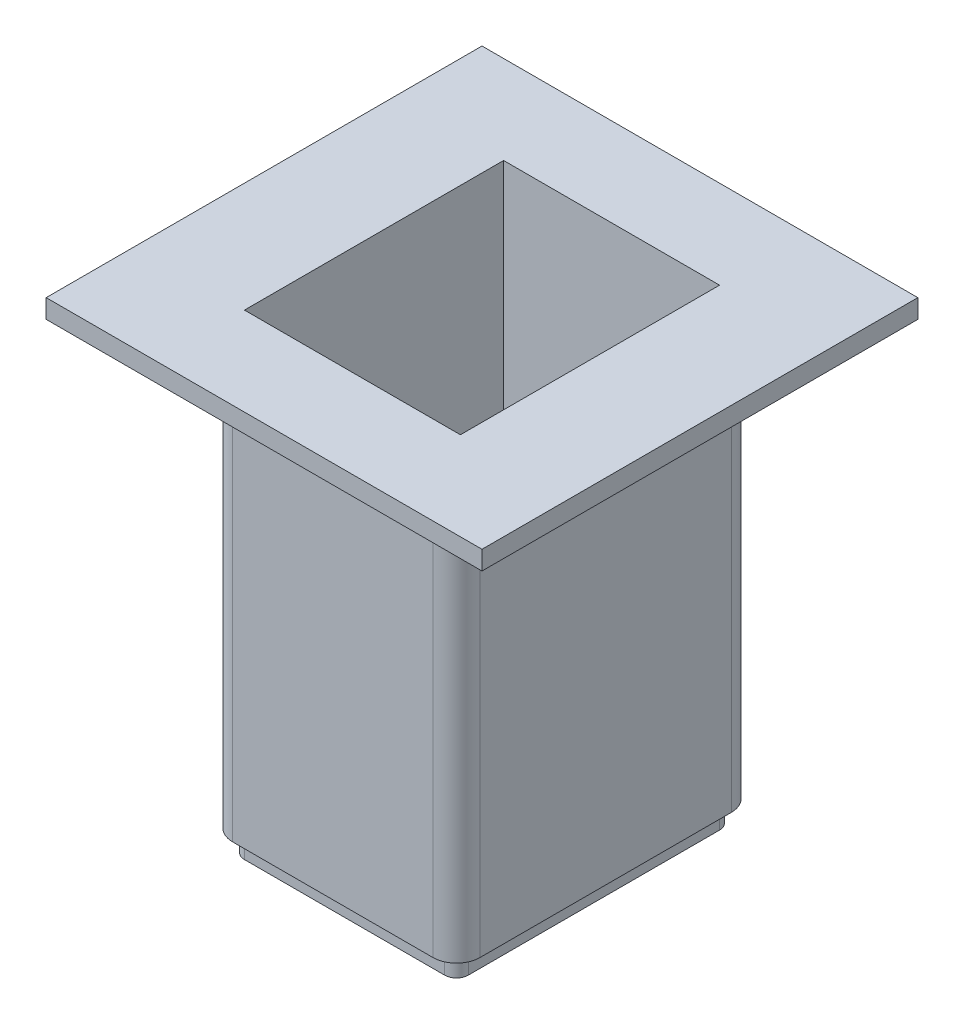
ISO-10303-21;
HEADER;
FILE_DESCRIPTION(('STEP AP214'),'2;1');
FILE_NAME('part.step','',(''),(''),'','','');
FILE_SCHEMA(('AUTOMOTIVE_DESIGN { 1 0 10303 214 1 1 1 1 }'));
ENDSEC;
DATA;
#1=APPLICATION_CONTEXT('core data for automotive mechanical design processes');
#2=APPLICATION_PROTOCOL_DEFINITION('international standard','automotive_design',2000,#1);
#3=PRODUCT_CONTEXT('',#1,'mechanical');
#4=PRODUCT('Part','Part','',(#3));
#5=PRODUCT_RELATED_PRODUCT_CATEGORY('part','',(#4));
#6=PRODUCT_DEFINITION_FORMATION('','',#4);
#7=PRODUCT_DEFINITION_CONTEXT('part definition',#1,'design');
#8=PRODUCT_DEFINITION('design','',#6,#7);
#9=PRODUCT_DEFINITION_SHAPE('','',#8);
#10=(LENGTH_UNIT() NAMED_UNIT(*) SI_UNIT(.MILLI.,.METRE.));
#11=(NAMED_UNIT(*) PLANE_ANGLE_UNIT() SI_UNIT($,.RADIAN.));
#12=(NAMED_UNIT(*) SI_UNIT($,.STERADIAN.) SOLID_ANGLE_UNIT());
#13=UNCERTAINTY_MEASURE_WITH_UNIT(LENGTH_MEASURE(1.E-05),#10,'distance_accuracy_value','');
#14=(GEOMETRIC_REPRESENTATION_CONTEXT(3) GLOBAL_UNCERTAINTY_ASSIGNED_CONTEXT((#13)) GLOBAL_UNIT_ASSIGNED_CONTEXT((#10,
#11,#12)) REPRESENTATION_CONTEXT('',''));
#15=CARTESIAN_POINT('',(0.,0.,0.));
#16=DIRECTION('',(0.,0.,1.));
#17=DIRECTION('',(1.,0.,0.));
#18=AXIS2_PLACEMENT_3D('',#15,#16,#17);
#19=CARTESIAN_POINT('',(13.25,27.85,16.5));
#20=DIRECTION('',(0.,0.,-1.));
#21=DIRECTION('',(-1.,0.,0.));
#22=AXIS2_PLACEMENT_3D('',#19,#20,#21);
#23=PLANE('',#22);
#24=DIRECTION('',(0.,-1.,0.));
#25=VECTOR('',#24,1.);
#26=CARTESIAN_POINT('',(13.75,31.95,16.5));
#27=LINE('',#26,#25);
#28=CARTESIAN_POINT('',(13.75,30.25,16.5));
#29=VERTEX_POINT('',#28);
#30=CARTESIAN_POINT('',(13.75,-29.35,16.5));
#31=VERTEX_POINT('',#30);
#32=EDGE_CURVE('E213',#29,#31,#27,.T.);
#33=ORIENTED_EDGE('',*,*,#32,.T.);
#34=DIRECTION('',(-1.,0.,0.));
#35=VECTOR('',#34,1.);
#36=CARTESIAN_POINT('',(13.75,-29.35,16.5));
#37=LINE('',#36,#35);
#38=CARTESIAN_POINT('',(-13.75,-29.35,16.5));
#39=VERTEX_POINT('',#38);
#40=EDGE_CURVE('E198',#31,#39,#37,.T.);
#41=ORIENTED_EDGE('',*,*,#40,.T.);
#42=DIRECTION('',(0.,-1.,0.));
#43=VECTOR('',#42,1.);
#44=CARTESIAN_POINT('',(-13.75,31.95,16.5));
#45=LINE('',#44,#43);
#46=CARTESIAN_POINT('',(-13.75,30.25,16.5));
#47=VERTEX_POINT('',#46);
#48=EDGE_CURVE('E232',#47,#39,#45,.T.);
#49=ORIENTED_EDGE('',*,*,#48,.F.);
#50=DIRECTION('',(-1.,0.,0.));
#51=VECTOR('',#50,1.);
#52=CARTESIAN_POINT('',(13.25,30.25,16.5));
#53=LINE('',#52,#51);
#54=EDGE_CURVE('E218',#29,#47,#53,.T.);
#55=ORIENTED_EDGE('',*,*,#54,.F.);
#56=EDGE_LOOP('',(#33,#41,#49,#55));
#57=FACE_BOUND('',#56,.T.);
#58=ADVANCED_FACE('F40',(#57),#23,.T.);
#59=CARTESIAN_POINT('',(13.25,27.85,-16.5));
#60=DIRECTION('',(0.,0.,1.));
#61=DIRECTION('',(1.,0.,0.));
#62=AXIS2_PLACEMENT_3D('',#59,#60,#61);
#63=PLANE('',#62);
#64=DIRECTION('',(0.,-1.,0.));
#65=VECTOR('',#64,1.);
#66=CARTESIAN_POINT('',(-13.75,31.95,-16.5));
#67=LINE('',#66,#65);
#68=CARTESIAN_POINT('',(-13.75,30.25,-16.5));
#69=VERTEX_POINT('',#68);
#70=CARTESIAN_POINT('',(-13.75,-29.35,-16.5));
#71=VERTEX_POINT('',#70);
#72=EDGE_CURVE('E219',#69,#71,#67,.T.);
#73=ORIENTED_EDGE('',*,*,#72,.T.);
#74=DIRECTION('',(1.,0.,0.));
#75=VECTOR('',#74,1.);
#76=CARTESIAN_POINT('',(-13.75,-29.35,-16.5));
#77=LINE('',#76,#75);
#78=CARTESIAN_POINT('',(13.75,-29.35,-16.5));
#79=VERTEX_POINT('',#78);
#80=EDGE_CURVE('E62',#71,#79,#77,.T.);
#81=ORIENTED_EDGE('',*,*,#80,.T.);
#82=DIRECTION('',(0.,-1.,0.));
#83=VECTOR('',#82,1.);
#84=CARTESIAN_POINT('',(13.75,31.95,-16.5));
#85=LINE('',#84,#83);
#86=CARTESIAN_POINT('',(13.75,30.25,-16.5));
#87=VERTEX_POINT('',#86);
#88=EDGE_CURVE('E216',#87,#79,#85,.T.);
#89=ORIENTED_EDGE('',*,*,#88,.F.);
#90=DIRECTION('',(1.,0.,0.));
#91=VECTOR('',#90,1.);
#92=CARTESIAN_POINT('',(13.25,30.25,-16.5));
#93=LINE('',#92,#91);
#94=EDGE_CURVE('E288',#69,#87,#93,.T.);
#95=ORIENTED_EDGE('',*,*,#94,.F.);
#96=EDGE_LOOP('',(#73,#81,#89,#95));
#97=FACE_BOUND('',#96,.T.);
#98=ADVANCED_FACE('F396',(#97),#63,.T.);
#99=CARTESIAN_POINT('',(14.25,27.85,17.5));
#100=DIRECTION('',(0.,0.,-1.));
#101=DIRECTION('',(-1.,0.,0.));
#102=AXIS2_PLACEMENT_3D('',#99,#100,#101);
#103=PLANE('',#102);
#104=DIRECTION('',(-1.,0.,0.));
#105=VECTOR('',#104,1.);
#106=CARTESIAN_POINT('',(12.75,-29.35,17.5));
#107=LINE('',#106,#105);
#108=CARTESIAN_POINT('',(12.75,-29.35,17.5));
#109=VERTEX_POINT('',#108);
#110=CARTESIAN_POINT('',(-12.75,-29.35,17.5));
#111=VERTEX_POINT('',#110);
#112=EDGE_CURVE('E385',#109,#111,#107,.T.);
#113=ORIENTED_EDGE('',*,*,#112,.F.);
#114=DIRECTION('',(0.,-1.,0.));
#115=VECTOR('',#114,1.);
#116=CARTESIAN_POINT('',(12.75,27.85,17.5));
#117=LINE('',#116,#115);
#118=CARTESIAN_POINT('',(12.75,-26.65,17.5));
#119=VERTEX_POINT('',#118);
#120=EDGE_CURVE('E258',#109,#119,#117,.F.);
#121=ORIENTED_EDGE('',*,*,#120,.T.);
#122=DIRECTION('',(-1.,0.,0.));
#123=VECTOR('',#122,1.);
#124=CARTESIAN_POINT('',(12.75,-26.65,17.5));
#125=LINE('',#124,#123);
#126=CARTESIAN_POINT('',(-12.75,-26.65,17.5));
#127=VERTEX_POINT('',#126);
#128=EDGE_CURVE('E363',#119,#127,#125,.T.);
#129=ORIENTED_EDGE('',*,*,#128,.T.);
#130=DIRECTION('',(0.,-1.,0.));
#131=VECTOR('',#130,1.);
#132=CARTESIAN_POINT('',(-12.75,27.85,17.5));
#133=LINE('',#132,#131);
#134=EDGE_CURVE('E269',#127,#111,#133,.T.);
#135=ORIENTED_EDGE('',*,*,#134,.T.);
#136=EDGE_LOOP('',(#113,#121,#129,#135));
#137=FACE_BOUND('',#136,.T.);
#138=ADVANCED_FACE('F424',(#137),#103,.F.);
#139=CARTESIAN_POINT('',(14.25,27.85,17.5));
#140=DIRECTION('',(-1.,0.,0.));
#141=DIRECTION('',(0.,0.,1.));
#142=AXIS2_PLACEMENT_3D('',#139,#140,#141);
#143=PLANE('',#142);
#144=DIRECTION('',(0.,0.,1.));
#145=VECTOR('',#144,1.);
#146=CARTESIAN_POINT('',(14.25,-29.35,-16.));
#147=LINE('',#146,#145);
#148=CARTESIAN_POINT('',(14.25,-29.35,-16.));
#149=VERTEX_POINT('',#148);
#150=CARTESIAN_POINT('',(14.25,-29.35,16.));
#151=VERTEX_POINT('',#150);
#152=EDGE_CURVE('E54',#149,#151,#147,.T.);
#153=ORIENTED_EDGE('',*,*,#152,.F.);
#154=DIRECTION('',(0.,-1.,0.));
#155=VECTOR('',#154,1.);
#156=CARTESIAN_POINT('',(14.25,27.85,-16.));
#157=LINE('',#156,#155);
#158=CARTESIAN_POINT('',(14.25,-26.65,-16.));
#159=VERTEX_POINT('',#158);
#160=EDGE_CURVE('E275',#149,#159,#157,.F.);
#161=ORIENTED_EDGE('',*,*,#160,.T.);
#162=DIRECTION('',(0.,0.,1.));
#163=VECTOR('',#162,1.);
#164=CARTESIAN_POINT('',(14.25,-26.65,-16.));
#165=LINE('',#164,#163);
#166=CARTESIAN_POINT('',(14.25,-26.65,16.));
#167=VERTEX_POINT('',#166);
#168=EDGE_CURVE('E368',#159,#167,#165,.T.);
#169=ORIENTED_EDGE('',*,*,#168,.T.);
#170=DIRECTION('',(0.,-1.,0.));
#171=VECTOR('',#170,1.);
#172=CARTESIAN_POINT('',(14.25,27.85,16.));
#173=LINE('',#172,#171);
#174=EDGE_CURVE('E283',#167,#151,#173,.T.);
#175=ORIENTED_EDGE('',*,*,#174,.T.);
#176=EDGE_LOOP('',(#153,#161,#169,#175));
#177=FACE_BOUND('',#176,.T.);
#178=ADVANCED_FACE('F428',(#177),#143,.F.);
#179=CARTESIAN_POINT('',(14.25,27.85,-17.5));
#180=DIRECTION('',(0.,0.,1.));
#181=DIRECTION('',(1.,0.,0.));
#182=AXIS2_PLACEMENT_3D('',#179,#180,#181);
#183=PLANE('',#182);
#184=DIRECTION('',(1.,0.,0.));
#185=VECTOR('',#184,1.);
#186=CARTESIAN_POINT('',(-12.75,-29.35,-17.5));
#187=LINE('',#186,#185);
#188=CARTESIAN_POINT('',(-12.75,-29.35,-17.5));
#189=VERTEX_POINT('',#188);
#190=CARTESIAN_POINT('',(12.75,-29.35,-17.5));
#191=VERTEX_POINT('',#190);
#192=EDGE_CURVE('E377',#189,#191,#187,.T.);
#193=ORIENTED_EDGE('',*,*,#192,.F.);
#194=DIRECTION('',(0.,-1.,0.));
#195=VECTOR('',#194,1.);
#196=CARTESIAN_POINT('',(-12.75,27.85,-17.5));
#197=LINE('',#196,#195);
#198=CARTESIAN_POINT('',(-12.75,-26.65,-17.5));
#199=VERTEX_POINT('',#198);
#200=EDGE_CURVE('E281',#189,#199,#197,.F.);
#201=ORIENTED_EDGE('',*,*,#200,.T.);
#202=DIRECTION('',(1.,0.,0.));
#203=VECTOR('',#202,1.);
#204=CARTESIAN_POINT('',(-12.75,-26.65,-17.5));
#205=LINE('',#204,#203);
#206=CARTESIAN_POINT('',(12.75,-26.65,-17.5));
#207=VERTEX_POINT('',#206);
#208=EDGE_CURVE('E351',#199,#207,#205,.T.);
#209=ORIENTED_EDGE('',*,*,#208,.T.);
#210=DIRECTION('',(0.,-1.,0.));
#211=VECTOR('',#210,1.);
#212=CARTESIAN_POINT('',(12.75,27.85,-17.5));
#213=LINE('',#212,#211);
#214=EDGE_CURVE('E278',#207,#191,#213,.T.);
#215=ORIENTED_EDGE('',*,*,#214,.T.);
#216=EDGE_LOOP('',(#193,#201,#209,#215));
#217=FACE_BOUND('',#216,.T.);
#218=ADVANCED_FACE('F467',(#217),#183,.F.);
#219=CARTESIAN_POINT('',(-14.25,27.85,17.5));
#220=DIRECTION('',(1.,0.,0.));
#221=DIRECTION('',(0.,0.,-1.));
#222=AXIS2_PLACEMENT_3D('',#219,#220,#221);
#223=PLANE('',#222);
#224=DIRECTION('',(0.,0.,-1.));
#225=VECTOR('',#224,1.);
#226=CARTESIAN_POINT('',(-14.25,-29.35,16.));
#227=LINE('',#226,#225);
#228=CARTESIAN_POINT('',(-14.25,-29.35,16.));
#229=VERTEX_POINT('',#228);
#230=CARTESIAN_POINT('',(-14.25,-29.35,-16.));
#231=VERTEX_POINT('',#230);
#232=EDGE_CURVE('E381',#229,#231,#227,.T.);
#233=ORIENTED_EDGE('',*,*,#232,.F.);
#234=DIRECTION('',(0.,-1.,0.));
#235=VECTOR('',#234,1.);
#236=CARTESIAN_POINT('',(-14.25,27.85,16.));
#237=LINE('',#236,#235);
#238=CARTESIAN_POINT('',(-14.25,-26.65,16.));
#239=VERTEX_POINT('',#238);
#240=EDGE_CURVE('E226',#229,#239,#237,.F.);
#241=ORIENTED_EDGE('',*,*,#240,.T.);
#242=DIRECTION('',(0.,0.,-1.));
#243=VECTOR('',#242,1.);
#244=CARTESIAN_POINT('',(-14.25,-26.65,16.));
#245=LINE('',#244,#243);
#246=CARTESIAN_POINT('',(-14.25,-26.65,-16.));
#247=VERTEX_POINT('',#246);
#248=EDGE_CURVE('E357',#239,#247,#245,.T.);
#249=ORIENTED_EDGE('',*,*,#248,.T.);
#250=DIRECTION('',(0.,-1.,0.));
#251=VECTOR('',#250,1.);
#252=CARTESIAN_POINT('',(-14.25,27.85,-16.));
#253=LINE('',#252,#251);
#254=EDGE_CURVE('E220',#247,#231,#253,.T.);
#255=ORIENTED_EDGE('',*,*,#254,.T.);
#256=EDGE_LOOP('',(#233,#241,#249,#255));
#257=FACE_BOUND('',#256,.T.);
#258=ADVANCED_FACE('F462',(#257),#223,.F.);
#259=CARTESIAN_POINT('',(-12.75,27.85,16.));
#260=DIRECTION('',(0.,-1.,0.));
#261=DIRECTION('',(0.,0.,-1.));
#262=AXIS2_PLACEMENT_3D('',#259,#260,#261);
#263=CYLINDRICAL_SURFACE('',#262,1.5);
#264=ORIENTED_EDGE('',*,*,#240,.F.);
#265=CARTESIAN_POINT('',(-12.75,-29.35,16.));
#266=DIRECTION('',(0.,-1.,0.));
#267=DIRECTION('',(0.,0.,-1.));
#268=AXIS2_PLACEMENT_3D('',#265,#266,#267);
#269=CIRCLE('',#268,1.5);
#270=EDGE_CURVE('E383',#111,#229,#269,.T.);
#271=ORIENTED_EDGE('',*,*,#270,.F.);
#272=ORIENTED_EDGE('',*,*,#134,.F.);
#273=CARTESIAN_POINT('',(-12.75,-26.65,16.));
#274=DIRECTION('',(0.,-1.,0.));
#275=DIRECTION('',(0.,0.,-1.));
#276=AXIS2_PLACEMENT_3D('',#273,#274,#275);
#277=CIRCLE('',#276,1.5);
#278=EDGE_CURVE('E360',#127,#239,#277,.T.);
#279=ORIENTED_EDGE('',*,*,#278,.T.);
#280=EDGE_LOOP('',(#264,#271,#272,#279));
#281=FACE_BOUND('',#280,.T.);
#282=ADVANCED_FACE('F459',(#281),#263,.T.);
#283=CARTESIAN_POINT('',(-12.75,27.85,-16.));
#284=DIRECTION('',(0.,-1.,0.));
#285=DIRECTION('',(0.,0.,-1.));
#286=AXIS2_PLACEMENT_3D('',#283,#284,#285);
#287=CYLINDRICAL_SURFACE('',#286,1.5);
#288=ORIENTED_EDGE('',*,*,#200,.F.);
#289=CARTESIAN_POINT('',(-12.75,-29.35,-16.));
#290=DIRECTION('',(0.,-1.,0.));
#291=DIRECTION('',(0.,0.,-1.));
#292=AXIS2_PLACEMENT_3D('',#289,#290,#291);
#293=CIRCLE('',#292,1.5);
#294=EDGE_CURVE('E379',#231,#189,#293,.T.);
#295=ORIENTED_EDGE('',*,*,#294,.F.);
#296=ORIENTED_EDGE('',*,*,#254,.F.);
#297=CARTESIAN_POINT('',(-12.75,-26.65,-16.));
#298=DIRECTION('',(0.,-1.,0.));
#299=DIRECTION('',(0.,0.,-1.));
#300=AXIS2_PLACEMENT_3D('',#297,#298,#299);
#301=CIRCLE('',#300,1.5);
#302=EDGE_CURVE('E354',#247,#199,#301,.T.);
#303=ORIENTED_EDGE('',*,*,#302,.T.);
#304=EDGE_LOOP('',(#288,#295,#296,#303));
#305=FACE_BOUND('',#304,.T.);
#306=ADVANCED_FACE('F450',(#305),#287,.T.);
#307=CARTESIAN_POINT('',(12.75,27.85,-16.));
#308=DIRECTION('',(0.,-1.,0.));
#309=DIRECTION('',(0.,0.,-1.));
#310=AXIS2_PLACEMENT_3D('',#307,#308,#309);
#311=CYLINDRICAL_SURFACE('',#310,1.5);
#312=ORIENTED_EDGE('',*,*,#160,.F.);
#313=CARTESIAN_POINT('',(12.75,-29.35,-16.));
#314=DIRECTION('',(0.,-1.,0.));
#315=DIRECTION('',(0.,0.,-1.));
#316=AXIS2_PLACEMENT_3D('',#313,#314,#315);
#317=CIRCLE('',#316,1.5);
#318=EDGE_CURVE('E375',#191,#149,#317,.T.);
#319=ORIENTED_EDGE('',*,*,#318,.F.);
#320=ORIENTED_EDGE('',*,*,#214,.F.);
#321=CARTESIAN_POINT('',(12.75,-26.65,-16.));
#322=DIRECTION('',(0.,-1.,0.));
#323=DIRECTION('',(0.,0.,-1.));
#324=AXIS2_PLACEMENT_3D('',#321,#322,#323);
#325=CIRCLE('',#324,1.5);
#326=EDGE_CURVE('E371',#207,#159,#325,.T.);
#327=ORIENTED_EDGE('',*,*,#326,.T.);
#328=EDGE_LOOP('',(#312,#319,#320,#327));
#329=FACE_BOUND('',#328,.T.);
#330=ADVANCED_FACE('F444',(#329),#311,.T.);
#331=CARTESIAN_POINT('',(12.75,27.85,16.));
#332=DIRECTION('',(0.,-1.,0.));
#333=DIRECTION('',(0.,0.,-1.));
#334=AXIS2_PLACEMENT_3D('',#331,#332,#333);
#335=CYLINDRICAL_SURFACE('',#334,1.5);
#336=ORIENTED_EDGE('',*,*,#120,.F.);
#337=CARTESIAN_POINT('',(12.75,-29.35,16.));
#338=DIRECTION('',(0.,-1.,0.));
#339=DIRECTION('',(0.,0.,-1.));
#340=AXIS2_PLACEMENT_3D('',#337,#338,#339);
#341=CIRCLE('',#340,1.5);
#342=EDGE_CURVE('E387',#151,#109,#341,.T.);
#343=ORIENTED_EDGE('',*,*,#342,.F.);
#344=ORIENTED_EDGE('',*,*,#174,.F.);
#345=CARTESIAN_POINT('',(12.75,-26.65,16.));
#346=DIRECTION('',(0.,-1.,0.));
#347=DIRECTION('',(0.,0.,-1.));
#348=AXIS2_PLACEMENT_3D('',#345,#346,#347);
#349=CIRCLE('',#348,1.5);
#350=EDGE_CURVE('E365',#167,#119,#349,.T.);
#351=ORIENTED_EDGE('',*,*,#350,.T.);
#352=EDGE_LOOP('',(#336,#343,#344,#351));
#353=FACE_BOUND('',#352,.T.);
#354=ADVANCED_FACE('F440',(#353),#335,.T.);
#355=CARTESIAN_POINT('',(13.75,31.95,-16.5));
#356=DIRECTION('',(1.,0.,0.));
#357=DIRECTION('',(0.,0.,-1.));
#358=AXIS2_PLACEMENT_3D('',#355,#356,#357);
#359=PLANE('',#358);
#360=DIRECTION('',(0.,0.,1.));
#361=VECTOR('',#360,1.);
#362=CARTESIAN_POINT('',(13.75,-29.35,-16.5));
#363=LINE('',#362,#361);
#364=EDGE_CURVE('E201',#79,#31,#363,.T.);
#365=ORIENTED_EDGE('',*,*,#364,.T.);
#366=ORIENTED_EDGE('',*,*,#32,.F.);
#367=DIRECTION('',(0.,0.,1.));
#368=VECTOR('',#367,1.);
#369=CARTESIAN_POINT('',(13.75,30.25,0.));
#370=LINE('',#369,#368);
#371=EDGE_CURVE('E265',#87,#29,#370,.T.);
#372=ORIENTED_EDGE('',*,*,#371,.F.);
#373=ORIENTED_EDGE('',*,*,#88,.T.);
#374=EDGE_LOOP('',(#365,#366,#372,#373));
#375=FACE_BOUND('',#374,.T.);
#376=ADVANCED_FACE('F211',(#375),#359,.F.);
#377=CARTESIAN_POINT('',(-13.75,31.95,-16.5));
#378=DIRECTION('',(-1.,0.,0.));
#379=DIRECTION('',(0.,0.,1.));
#380=AXIS2_PLACEMENT_3D('',#377,#378,#379);
#381=PLANE('',#380);
#382=DIRECTION('',(0.,0.,-1.));
#383=VECTOR('',#382,1.);
#384=CARTESIAN_POINT('',(-13.75,-29.35,16.5));
#385=LINE('',#384,#383);
#386=EDGE_CURVE('E202',#39,#71,#385,.T.);
#387=ORIENTED_EDGE('',*,*,#386,.T.);
#388=ORIENTED_EDGE('',*,*,#72,.F.);
#389=DIRECTION('',(0.,0.,-1.));
#390=VECTOR('',#389,1.);
#391=CARTESIAN_POINT('',(-13.75,30.25,0.));
#392=LINE('',#391,#390);
#393=EDGE_CURVE('E230',#47,#69,#392,.T.);
#394=ORIENTED_EDGE('',*,*,#393,.F.);
#395=ORIENTED_EDGE('',*,*,#48,.T.);
#396=EDGE_LOOP('',(#387,#388,#394,#395));
#397=FACE_BOUND('',#396,.T.);
#398=ADVANCED_FACE('F392',(#397),#381,.F.);
#399=CARTESIAN_POINT('',(0.,-29.15,-19.));
#400=DIRECTION('',(0.,0.,1.));
#401=DIRECTION('',(1.,0.,0.));
#402=AXIS2_PLACEMENT_3D('',#399,#400,#401);
#403=PLANE('',#402);
#404=DIRECTION('',(1.,0.,0.));
#405=VECTOR('',#404,1.);
#406=CARTESIAN_POINT('',(-12.75,-26.65,-19.));
#407=LINE('',#406,#405);
#408=CARTESIAN_POINT('',(-12.75,-26.65,-19.));
#409=VERTEX_POINT('',#408);
#410=CARTESIAN_POINT('',(12.75,-26.65,-19.));
#411=VERTEX_POINT('',#410);
#412=EDGE_CURVE('E347',#409,#411,#407,.T.);
#413=ORIENTED_EDGE('',*,*,#412,.F.);
#414=DIRECTION('',(0.,1.,0.));
#415=VECTOR('',#414,1.);
#416=CARTESIAN_POINT('',(-12.75,-29.15,-19.));
#417=LINE('',#416,#415);
#418=CARTESIAN_POINT('',(-12.75,27.85,-19.));
#419=VERTEX_POINT('',#418);
#420=EDGE_CURVE('E309',#409,#419,#417,.T.);
#421=ORIENTED_EDGE('',*,*,#420,.T.);
#422=DIRECTION('',(1.,0.,0.));
#423=VECTOR('',#422,1.);
#424=CARTESIAN_POINT('',(0.,27.85,-19.));
#425=LINE('',#424,#423);
#426=CARTESIAN_POINT('',(12.75,27.85,-19.));
#427=VERTEX_POINT('',#426);
#428=EDGE_CURVE('E332',#419,#427,#425,.T.);
#429=ORIENTED_EDGE('',*,*,#428,.T.);
#430=DIRECTION('',(0.,1.,0.));
#431=VECTOR('',#430,1.);
#432=CARTESIAN_POINT('',(12.75,-29.15,-19.));
#433=LINE('',#432,#431);
#434=EDGE_CURVE('E293',#411,#427,#433,.T.);
#435=ORIENTED_EDGE('',*,*,#434,.F.);
#436=EDGE_LOOP('',(#413,#421,#429,#435));
#437=FACE_BOUND('',#436,.T.);
#438=ADVANCED_FACE('F438',(#437),#403,.F.);
#439=CARTESIAN_POINT('',(12.75,-29.15,-16.));
#440=DIRECTION('',(0.,1.,0.));
#441=DIRECTION('',(0.,0.,1.));
#442=AXIS2_PLACEMENT_3D('',#439,#440,#441);
#443=CYLINDRICAL_SURFACE('',#442,3.);
#444=CARTESIAN_POINT('',(12.75,-26.65,-16.));
#445=DIRECTION('',(0.,-1.,0.));
#446=DIRECTION('',(0.,0.,-1.));
#447=AXIS2_PLACEMENT_3D('',#444,#445,#446);
#448=CIRCLE('',#447,3.);
#449=CARTESIAN_POINT('',(15.75,-26.65,-16.));
#450=VERTEX_POINT('',#449);
#451=EDGE_CURVE('E345',#411,#450,#448,.T.);
#452=ORIENTED_EDGE('',*,*,#451,.F.);
#453=ORIENTED_EDGE('',*,*,#434,.T.);
#454=CARTESIAN_POINT('',(12.75,27.85,-16.));
#455=DIRECTION('',(0.,-1.,0.));
#456=DIRECTION('',(0.,0.,-1.));
#457=AXIS2_PLACEMENT_3D('',#454,#455,#456);
#458=CIRCLE('',#457,3.);
#459=CARTESIAN_POINT('',(15.75,27.85,-16.));
#460=VERTEX_POINT('',#459);
#461=EDGE_CURVE('E329',#427,#460,#458,.T.);
#462=ORIENTED_EDGE('',*,*,#461,.T.);
#463=DIRECTION('',(0.,1.,0.));
#464=VECTOR('',#463,1.);
#465=CARTESIAN_POINT('',(15.75,-29.15,-16.));
#466=LINE('',#465,#464);
#467=EDGE_CURVE('E297',#450,#460,#466,.T.);
#468=ORIENTED_EDGE('',*,*,#467,.F.);
#469=EDGE_LOOP('',(#452,#453,#462,#468));
#470=FACE_BOUND('',#469,.T.);
#471=ADVANCED_FACE('F521',(#470),#443,.T.);
#472=CARTESIAN_POINT('',(15.75,-29.15,0.));
#473=DIRECTION('',(-1.,0.,0.));
#474=DIRECTION('',(0.,0.,1.));
#475=AXIS2_PLACEMENT_3D('',#472,#473,#474);
#476=PLANE('',#475);
#477=DIRECTION('',(0.,0.,1.));
#478=VECTOR('',#477,1.);
#479=CARTESIAN_POINT('',(15.75,-26.65,-16.));
#480=LINE('',#479,#478);
#481=CARTESIAN_POINT('',(15.75,-26.65,16.));
#482=VERTEX_POINT('',#481);
#483=EDGE_CURVE('E343',#450,#482,#480,.T.);
#484=ORIENTED_EDGE('',*,*,#483,.F.);
#485=ORIENTED_EDGE('',*,*,#467,.T.);
#486=DIRECTION('',(0.,0.,1.));
#487=VECTOR('',#486,1.);
#488=CARTESIAN_POINT('',(15.75,27.85,0.));
#489=LINE('',#488,#487);
#490=CARTESIAN_POINT('',(15.75,27.85,16.));
#491=VERTEX_POINT('',#490);
#492=EDGE_CURVE('E326',#460,#491,#489,.T.);
#493=ORIENTED_EDGE('',*,*,#492,.T.);
#494=DIRECTION('',(0.,1.,0.));
#495=VECTOR('',#494,1.);
#496=CARTESIAN_POINT('',(15.75,-29.15,16.));
#497=LINE('',#496,#495);
#498=EDGE_CURVE('E299',#482,#491,#497,.T.);
#499=ORIENTED_EDGE('',*,*,#498,.F.);
#500=EDGE_LOOP('',(#484,#485,#493,#499));
#501=FACE_BOUND('',#500,.T.);
#502=ADVANCED_FACE('F518',(#501),#476,.F.);
#503=CARTESIAN_POINT('',(12.75,-29.15,16.));
#504=DIRECTION('',(0.,1.,0.));
#505=DIRECTION('',(0.,0.,1.));
#506=AXIS2_PLACEMENT_3D('',#503,#504,#505);
#507=CYLINDRICAL_SURFACE('',#506,3.);
#508=CARTESIAN_POINT('',(12.75,-26.65,16.));
#509=DIRECTION('',(0.,-1.,0.));
#510=DIRECTION('',(0.,0.,-1.));
#511=AXIS2_PLACEMENT_3D('',#508,#509,#510);
#512=CIRCLE('',#511,3.);
#513=CARTESIAN_POINT('',(12.75,-26.65,19.));
#514=VERTEX_POINT('',#513);
#515=EDGE_CURVE('E341',#482,#514,#512,.T.);
#516=ORIENTED_EDGE('',*,*,#515,.F.);
#517=ORIENTED_EDGE('',*,*,#498,.T.);
#518=CARTESIAN_POINT('',(12.75,27.85,16.));
#519=DIRECTION('',(0.,-1.,0.));
#520=DIRECTION('',(0.,0.,-1.));
#521=AXIS2_PLACEMENT_3D('',#518,#519,#520);
#522=CIRCLE('',#521,3.);
#523=CARTESIAN_POINT('',(12.75,27.85,19.));
#524=VERTEX_POINT('',#523);
#525=EDGE_CURVE('E323',#491,#524,#522,.T.);
#526=ORIENTED_EDGE('',*,*,#525,.T.);
#527=DIRECTION('',(0.,1.,0.));
#528=VECTOR('',#527,1.);
#529=CARTESIAN_POINT('',(12.75,-29.15,19.));
#530=LINE('',#529,#528);
#531=EDGE_CURVE('E301',#514,#524,#530,.T.);
#532=ORIENTED_EDGE('',*,*,#531,.F.);
#533=EDGE_LOOP('',(#516,#517,#526,#532));
#534=FACE_BOUND('',#533,.T.);
#535=ADVANCED_FACE('F514',(#534),#507,.T.);
#536=CARTESIAN_POINT('',(0.,-29.15,19.));
#537=DIRECTION('',(0.,0.,-1.));
#538=DIRECTION('',(-1.,0.,0.));
#539=AXIS2_PLACEMENT_3D('',#536,#537,#538);
#540=PLANE('',#539);
#541=DIRECTION('',(-1.,0.,0.));
#542=VECTOR('',#541,1.);
#543=CARTESIAN_POINT('',(12.75,-26.65,19.));
#544=LINE('',#543,#542);
#545=CARTESIAN_POINT('',(-12.75,-26.65,19.));
#546=VERTEX_POINT('',#545);
#547=EDGE_CURVE('E339',#514,#546,#544,.T.);
#548=ORIENTED_EDGE('',*,*,#547,.F.);
#549=ORIENTED_EDGE('',*,*,#531,.T.);
#550=DIRECTION('',(-1.,0.,0.));
#551=VECTOR('',#550,1.);
#552=CARTESIAN_POINT('',(0.,27.85,19.));
#553=LINE('',#552,#551);
#554=CARTESIAN_POINT('',(-12.75,27.85,19.));
#555=VERTEX_POINT('',#554);
#556=EDGE_CURVE('E320',#524,#555,#553,.T.);
#557=ORIENTED_EDGE('',*,*,#556,.T.);
#558=DIRECTION('',(0.,1.,0.));
#559=VECTOR('',#558,1.);
#560=CARTESIAN_POINT('',(-12.75,-29.15,19.));
#561=LINE('',#560,#559);
#562=EDGE_CURVE('E303',#546,#555,#561,.T.);
#563=ORIENTED_EDGE('',*,*,#562,.F.);
#564=EDGE_LOOP('',(#548,#549,#557,#563));
#565=FACE_BOUND('',#564,.T.);
#566=ADVANCED_FACE('F510',(#565),#540,.F.);
#567=CARTESIAN_POINT('',(-12.75,-29.15,16.));
#568=DIRECTION('',(0.,1.,0.));
#569=DIRECTION('',(0.,0.,1.));
#570=AXIS2_PLACEMENT_3D('',#567,#568,#569);
#571=CYLINDRICAL_SURFACE('',#570,3.);
#572=CARTESIAN_POINT('',(-12.75,-26.65,16.));
#573=DIRECTION('',(0.,-1.,0.));
#574=DIRECTION('',(0.,0.,-1.));
#575=AXIS2_PLACEMENT_3D('',#572,#573,#574);
#576=CIRCLE('',#575,3.);
#577=CARTESIAN_POINT('',(-15.75,-26.65,16.));
#578=VERTEX_POINT('',#577);
#579=EDGE_CURVE('E337',#546,#578,#576,.T.);
#580=ORIENTED_EDGE('',*,*,#579,.F.);
#581=ORIENTED_EDGE('',*,*,#562,.T.);
#582=CARTESIAN_POINT('',(-12.75,27.85,16.));
#583=DIRECTION('',(0.,-1.,0.));
#584=DIRECTION('',(0.,0.,-1.));
#585=AXIS2_PLACEMENT_3D('',#582,#583,#584);
#586=CIRCLE('',#585,3.);
#587=CARTESIAN_POINT('',(-15.75,27.85,16.));
#588=VERTEX_POINT('',#587);
#589=EDGE_CURVE('E317',#555,#588,#586,.T.);
#590=ORIENTED_EDGE('',*,*,#589,.T.);
#591=DIRECTION('',(0.,1.,0.));
#592=VECTOR('',#591,1.);
#593=CARTESIAN_POINT('',(-15.75,-29.15,16.));
#594=LINE('',#593,#592);
#595=EDGE_CURVE('E305',#578,#588,#594,.T.);
#596=ORIENTED_EDGE('',*,*,#595,.F.);
#597=EDGE_LOOP('',(#580,#581,#590,#596));
#598=FACE_BOUND('',#597,.T.);
#599=ADVANCED_FACE('F506',(#598),#571,.T.);
#600=CARTESIAN_POINT('',(-15.75,-29.15,0.));
#601=DIRECTION('',(1.,0.,0.));
#602=DIRECTION('',(0.,0.,-1.));
#603=AXIS2_PLACEMENT_3D('',#600,#601,#602);
#604=PLANE('',#603);
#605=DIRECTION('',(0.,0.,-1.));
#606=VECTOR('',#605,1.);
#607=CARTESIAN_POINT('',(-15.75,-26.65,16.));
#608=LINE('',#607,#606);
#609=CARTESIAN_POINT('',(-15.75,-26.65,-16.));
#610=VERTEX_POINT('',#609);
#611=EDGE_CURVE('E335',#578,#610,#608,.T.);
#612=ORIENTED_EDGE('',*,*,#611,.F.);
#613=ORIENTED_EDGE('',*,*,#595,.T.);
#614=DIRECTION('',(0.,0.,-1.));
#615=VECTOR('',#614,1.);
#616=CARTESIAN_POINT('',(-15.75,27.85,0.));
#617=LINE('',#616,#615);
#618=CARTESIAN_POINT('',(-15.75,27.85,-16.));
#619=VERTEX_POINT('',#618);
#620=EDGE_CURVE('E314',#588,#619,#617,.T.);
#621=ORIENTED_EDGE('',*,*,#620,.T.);
#622=DIRECTION('',(0.,1.,0.));
#623=VECTOR('',#622,1.);
#624=CARTESIAN_POINT('',(-15.75,-29.15,-16.));
#625=LINE('',#624,#623);
#626=EDGE_CURVE('E307',#610,#619,#625,.T.);
#627=ORIENTED_EDGE('',*,*,#626,.F.);
#628=EDGE_LOOP('',(#612,#613,#621,#627));
#629=FACE_BOUND('',#628,.T.);
#630=ADVANCED_FACE('F502',(#629),#604,.F.);
#631=CARTESIAN_POINT('',(-12.75,-29.15,-16.));
#632=DIRECTION('',(0.,1.,0.));
#633=DIRECTION('',(0.,0.,1.));
#634=AXIS2_PLACEMENT_3D('',#631,#632,#633);
#635=CYLINDRICAL_SURFACE('',#634,3.);
#636=CARTESIAN_POINT('',(-12.75,-26.65,-16.));
#637=DIRECTION('',(0.,-1.,0.));
#638=DIRECTION('',(0.,0.,-1.));
#639=AXIS2_PLACEMENT_3D('',#636,#637,#638);
#640=CIRCLE('',#639,3.);
#641=EDGE_CURVE('E349',#610,#409,#640,.T.);
#642=ORIENTED_EDGE('',*,*,#641,.F.);
#643=ORIENTED_EDGE('',*,*,#626,.T.);
#644=CARTESIAN_POINT('',(-12.75,27.85,-16.));
#645=DIRECTION('',(0.,-1.,0.));
#646=DIRECTION('',(0.,0.,-1.));
#647=AXIS2_PLACEMENT_3D('',#644,#645,#646);
#648=CIRCLE('',#647,3.);
#649=EDGE_CURVE('E311',#619,#419,#648,.T.);
#650=ORIENTED_EDGE('',*,*,#649,.T.);
#651=ORIENTED_EDGE('',*,*,#420,.F.);
#652=EDGE_LOOP('',(#642,#643,#650,#651));
#653=FACE_BOUND('',#652,.T.);
#654=ADVANCED_FACE('F401',(#653),#635,.T.);
#655=CARTESIAN_POINT('',(0.,30.25,0.));
#656=DIRECTION('',(0.,-1.,0.));
#657=DIRECTION('',(0.,0.,-1.));
#658=AXIS2_PLACEMENT_3D('',#655,#656,#657);
#659=PLANE('',#658);
#660=ORIENTED_EDGE('',*,*,#371,.T.);
#661=ORIENTED_EDGE('',*,*,#54,.T.);
#662=ORIENTED_EDGE('',*,*,#393,.T.);
#663=ORIENTED_EDGE('',*,*,#94,.T.);
#664=EDGE_LOOP('',(#660,#661,#662,#663));
#665=FACE_BOUND('',#664,.T.);
#666=DIRECTION('',(0.,0.,1.));
#667=VECTOR('',#666,1.);
#668=CARTESIAN_POINT('',(-27.75,30.25,0.));
#669=LINE('',#668,#667);
#670=CARTESIAN_POINT('',(-27.75,30.25,-27.75));
#671=VERTEX_POINT('',#670);
#672=CARTESIAN_POINT('',(-27.75,30.25,27.75));
#673=VERTEX_POINT('',#672);
#674=EDGE_CURVE('E267',#671,#673,#669,.T.);
#675=ORIENTED_EDGE('',*,*,#674,.T.);
#676=DIRECTION('',(1.,0.,0.));
#677=VECTOR('',#676,1.);
#678=CARTESIAN_POINT('',(-28.75,30.25,27.75));
#679=LINE('',#678,#677);
#680=CARTESIAN_POINT('',(27.75,30.25,27.75));
#681=VERTEX_POINT('',#680);
#682=EDGE_CURVE('E251',#673,#681,#679,.T.);
#683=ORIENTED_EDGE('',*,*,#682,.T.);
#684=DIRECTION('',(0.,0.,-1.));
#685=VECTOR('',#684,1.);
#686=CARTESIAN_POINT('',(27.75,30.25,0.));
#687=LINE('',#686,#685);
#688=CARTESIAN_POINT('',(27.75,30.25,-27.75));
#689=VERTEX_POINT('',#688);
#690=EDGE_CURVE('E242',#681,#689,#687,.T.);
#691=ORIENTED_EDGE('',*,*,#690,.T.);
#692=DIRECTION('',(-1.,0.,0.));
#693=VECTOR('',#692,1.);
#694=CARTESIAN_POINT('',(-28.75,30.25,-27.75));
#695=LINE('',#694,#693);
#696=EDGE_CURVE('E253',#689,#671,#695,.T.);
#697=ORIENTED_EDGE('',*,*,#696,.T.);
#698=EDGE_LOOP('',(#675,#683,#691,#697));
#699=FACE_BOUND('',#698,.T.);
#700=ADVANCED_FACE('F397',(#665,#699),#659,.F.);
#701=CARTESIAN_POINT('',(0.,27.85,0.));
#702=DIRECTION('',(0.,-1.,0.));
#703=DIRECTION('',(0.,0.,-1.));
#704=AXIS2_PLACEMENT_3D('',#701,#702,#703);
#705=PLANE('',#704);
#706=ORIENTED_EDGE('',*,*,#461,.F.);
#707=ORIENTED_EDGE('',*,*,#428,.F.);
#708=ORIENTED_EDGE('',*,*,#649,.F.);
#709=ORIENTED_EDGE('',*,*,#620,.F.);
#710=ORIENTED_EDGE('',*,*,#589,.F.);
#711=ORIENTED_EDGE('',*,*,#556,.F.);
#712=ORIENTED_EDGE('',*,*,#525,.F.);
#713=ORIENTED_EDGE('',*,*,#492,.F.);
#714=EDGE_LOOP('',(#706,#707,#708,#709,#710,#711,#712,#713));
#715=FACE_BOUND('',#714,.T.);
#716=DIRECTION('',(1.,0.,0.));
#717=VECTOR('',#716,1.);
#718=CARTESIAN_POINT('',(-28.75,27.85,27.75));
#719=LINE('',#718,#717);
#720=CARTESIAN_POINT('',(-27.75,27.85,27.75));
#721=VERTEX_POINT('',#720);
#722=CARTESIAN_POINT('',(27.75,27.85,27.75));
#723=VERTEX_POINT('',#722);
#724=EDGE_CURVE('E248',#721,#723,#719,.T.);
#725=ORIENTED_EDGE('',*,*,#724,.F.);
#726=DIRECTION('',(0.,0.,1.));
#727=VECTOR('',#726,1.);
#728=CARTESIAN_POINT('',(-27.75,27.85,0.));
#729=LINE('',#728,#727);
#730=CARTESIAN_POINT('',(-27.75,27.85,-27.75));
#731=VERTEX_POINT('',#730);
#732=EDGE_CURVE('E263',#731,#721,#729,.T.);
#733=ORIENTED_EDGE('',*,*,#732,.F.);
#734=DIRECTION('',(-1.,0.,0.));
#735=VECTOR('',#734,1.);
#736=CARTESIAN_POINT('',(-28.75,27.85,-27.75));
#737=LINE('',#736,#735);
#738=CARTESIAN_POINT('',(27.75,27.85,-27.75));
#739=VERTEX_POINT('',#738);
#740=EDGE_CURVE('E223',#739,#731,#737,.T.);
#741=ORIENTED_EDGE('',*,*,#740,.F.);
#742=DIRECTION('',(0.,0.,-1.));
#743=VECTOR('',#742,1.);
#744=CARTESIAN_POINT('',(27.75,27.85,0.));
#745=LINE('',#744,#743);
#746=EDGE_CURVE('E234',#723,#739,#745,.T.);
#747=ORIENTED_EDGE('',*,*,#746,.F.);
#748=EDGE_LOOP('',(#725,#733,#741,#747));
#749=FACE_BOUND('',#748,.T.);
#750=ADVANCED_FACE('F400',(#715,#749),#705,.T.);
#751=CARTESIAN_POINT('',(-28.75,30.25,-27.75));
#752=DIRECTION('',(0.,0.,1.));
#753=DIRECTION('',(1.,0.,0.));
#754=AXIS2_PLACEMENT_3D('',#751,#752,#753);
#755=PLANE('',#754);
#756=DIRECTION('',(0.,1.,0.));
#757=VECTOR('',#756,1.);
#758=CARTESIAN_POINT('',(-27.75,-29.35,-27.75));
#759=LINE('',#758,#757);
#760=EDGE_CURVE('E290',#731,#671,#759,.T.);
#761=ORIENTED_EDGE('',*,*,#760,.T.);
#762=ORIENTED_EDGE('',*,*,#696,.F.);
#763=DIRECTION('',(0.,1.,0.));
#764=VECTOR('',#763,1.);
#765=CARTESIAN_POINT('',(27.75,-29.35,-27.75));
#766=LINE('',#765,#764);
#767=EDGE_CURVE('E291',#739,#689,#766,.T.);
#768=ORIENTED_EDGE('',*,*,#767,.F.);
#769=ORIENTED_EDGE('',*,*,#740,.T.);
#770=EDGE_LOOP('',(#761,#762,#768,#769));
#771=FACE_BOUND('',#770,.T.);
#772=ADVANCED_FACE('F409',(#771),#755,.F.);
#773=CARTESIAN_POINT('',(-28.75,30.25,27.75));
#774=DIRECTION('',(0.,0.,-1.));
#775=DIRECTION('',(-1.,0.,0.));
#776=AXIS2_PLACEMENT_3D('',#773,#774,#775);
#777=PLANE('',#776);
#778=DIRECTION('',(0.,1.,0.));
#779=VECTOR('',#778,1.);
#780=CARTESIAN_POINT('',(-27.75,30.25,27.75));
#781=LINE('',#780,#779);
#782=EDGE_CURVE('E12',#721,#673,#781,.T.);
#783=ORIENTED_EDGE('',*,*,#782,.F.);
#784=ORIENTED_EDGE('',*,*,#724,.T.);
#785=DIRECTION('',(0.,-1.,0.));
#786=VECTOR('',#785,1.);
#787=CARTESIAN_POINT('',(27.75,30.25,27.75));
#788=LINE('',#787,#786);
#789=EDGE_CURVE('E47',#681,#723,#788,.T.);
#790=ORIENTED_EDGE('',*,*,#789,.F.);
#791=ORIENTED_EDGE('',*,*,#682,.F.);
#792=EDGE_LOOP('',(#783,#784,#790,#791));
#793=FACE_BOUND('',#792,.T.);
#794=ADVANCED_FACE('F249',(#793),#777,.F.);
#795=CARTESIAN_POINT('',(-27.75,31.95,16.5));
#796=DIRECTION('',(1.,0.,0.));
#797=DIRECTION('',(0.,0.,-1.));
#798=AXIS2_PLACEMENT_3D('',#795,#796,#797);
#799=PLANE('',#798);
#800=ORIENTED_EDGE('',*,*,#674,.F.);
#801=ORIENTED_EDGE('',*,*,#760,.F.);
#802=ORIENTED_EDGE('',*,*,#732,.T.);
#803=ORIENTED_EDGE('',*,*,#782,.T.);
#804=EDGE_LOOP('',(#800,#801,#802,#803));
#805=FACE_BOUND('',#804,.T.);
#806=ADVANCED_FACE('F406',(#805),#799,.F.);
#807=CARTESIAN_POINT('',(27.75,31.95,16.5));
#808=DIRECTION('',(-1.,0.,0.));
#809=DIRECTION('',(0.,0.,1.));
#810=AXIS2_PLACEMENT_3D('',#807,#808,#809);
#811=PLANE('',#810);
#812=ORIENTED_EDGE('',*,*,#690,.F.);
#813=ORIENTED_EDGE('',*,*,#789,.T.);
#814=ORIENTED_EDGE('',*,*,#746,.T.);
#815=ORIENTED_EDGE('',*,*,#767,.T.);
#816=EDGE_LOOP('',(#812,#813,#814,#815));
#817=FACE_BOUND('',#816,.T.);
#818=ADVANCED_FACE('F239',(#817),#811,.F.);
#819=CARTESIAN_POINT('',(-12.75,-26.65,-16.));
#820=DIRECTION('',(0.,-1.,0.));
#821=DIRECTION('',(0.,0.,-1.));
#822=AXIS2_PLACEMENT_3D('',#819,#820,#821);
#823=PLANE('',#822);
#824=ORIENTED_EDGE('',*,*,#208,.F.);
#825=ORIENTED_EDGE('',*,*,#302,.F.);
#826=ORIENTED_EDGE('',*,*,#248,.F.);
#827=ORIENTED_EDGE('',*,*,#278,.F.);
#828=ORIENTED_EDGE('',*,*,#128,.F.);
#829=ORIENTED_EDGE('',*,*,#350,.F.);
#830=ORIENTED_EDGE('',*,*,#168,.F.);
#831=ORIENTED_EDGE('',*,*,#326,.F.);
#832=EDGE_LOOP('',(#824,#825,#826,#827,#828,#829,#830,#831));
#833=FACE_BOUND('',#832,.T.);
#834=ORIENTED_EDGE('',*,*,#641,.T.);
#835=ORIENTED_EDGE('',*,*,#412,.T.);
#836=ORIENTED_EDGE('',*,*,#451,.T.);
#837=ORIENTED_EDGE('',*,*,#483,.T.);
#838=ORIENTED_EDGE('',*,*,#515,.T.);
#839=ORIENTED_EDGE('',*,*,#547,.T.);
#840=ORIENTED_EDGE('',*,*,#579,.T.);
#841=ORIENTED_EDGE('',*,*,#611,.T.);
#842=EDGE_LOOP('',(#834,#835,#836,#837,#838,#839,#840,#841));
#843=FACE_BOUND('',#842,.T.);
#844=ADVANCED_FACE('F433',(#833,#843),#823,.T.);
#845=CARTESIAN_POINT('',(12.75,-29.35,16.));
#846=DIRECTION('',(0.,-1.,0.));
#847=DIRECTION('',(0.,0.,-1.));
#848=AXIS2_PLACEMENT_3D('',#845,#846,#847);
#849=PLANE('',#848);
#850=ORIENTED_EDGE('',*,*,#80,.F.);
#851=ORIENTED_EDGE('',*,*,#386,.F.);
#852=ORIENTED_EDGE('',*,*,#40,.F.);
#853=ORIENTED_EDGE('',*,*,#364,.F.);
#854=EDGE_LOOP('',(#850,#851,#852,#853));
#855=FACE_BOUND('',#854,.T.);
#856=ORIENTED_EDGE('',*,*,#342,.T.);
#857=ORIENTED_EDGE('',*,*,#112,.T.);
#858=ORIENTED_EDGE('',*,*,#270,.T.);
#859=ORIENTED_EDGE('',*,*,#232,.T.);
#860=ORIENTED_EDGE('',*,*,#294,.T.);
#861=ORIENTED_EDGE('',*,*,#192,.T.);
#862=ORIENTED_EDGE('',*,*,#318,.T.);
#863=ORIENTED_EDGE('',*,*,#152,.T.);
#864=EDGE_LOOP('',(#856,#857,#858,#859,#860,#861,#862,#863));
#865=FACE_BOUND('',#864,.T.);
#866=ADVANCED_FACE('F200',(#855,#865),#849,.T.);
#867=CLOSED_SHELL('',(#58,#98,#138,#178,#218,#258,#282,#306,#330,#354,#376,#398,#438,#471,#502,
#535,#566,#599,#630,#654,#700,#750,#772,#794,#806,#818,#844,#866));
#868=MANIFOLD_SOLID_BREP('B2',#867);
#869=ADVANCED_BREP_SHAPE_REPRESENTATION('',(#18,#868),#14);
#870=SHAPE_DEFINITION_REPRESENTATION(#9,#869);
ENDSEC;
END-ISO-10303-21;
